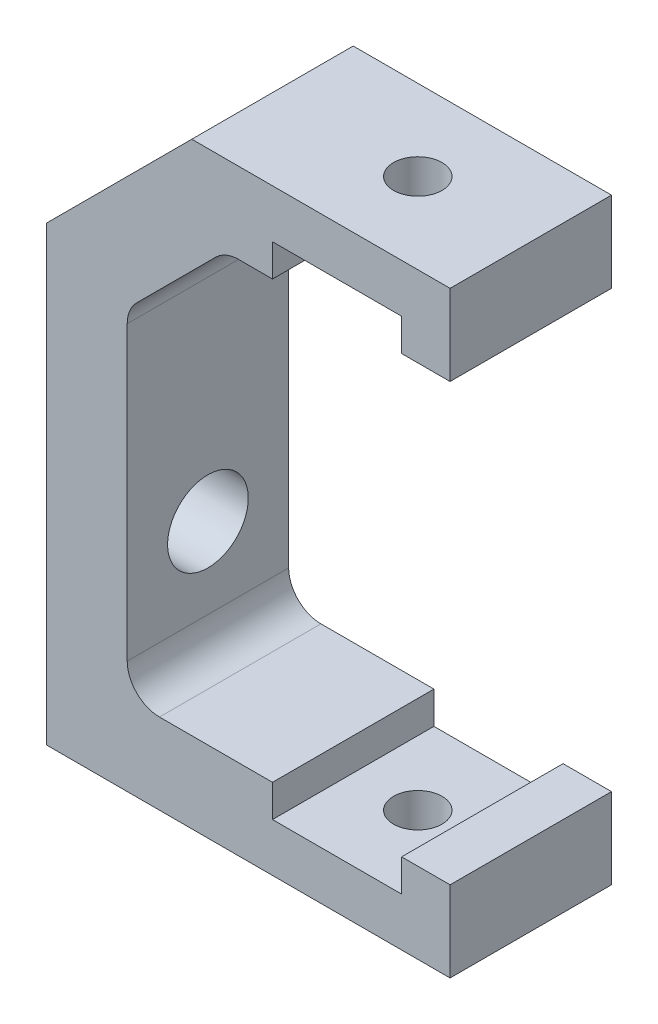
ISO-10303-21;
HEADER;
FILE_DESCRIPTION(('STEP AP214'),'2;1');
FILE_NAME('part.step','',(''),(''),'','','');
FILE_SCHEMA(('AUTOMOTIVE_DESIGN { 1 0 10303 214 1 1 1 1 }'));
ENDSEC;
DATA;
#1=APPLICATION_CONTEXT('core data for automotive mechanical design processes');
#2=APPLICATION_PROTOCOL_DEFINITION('international standard','automotive_design',2000,#1);
#3=PRODUCT_CONTEXT('',#1,'mechanical');
#4=PRODUCT('Part','Part','',(#3));
#5=PRODUCT_RELATED_PRODUCT_CATEGORY('part','',(#4));
#6=PRODUCT_DEFINITION_FORMATION('','',#4);
#7=PRODUCT_DEFINITION_CONTEXT('part definition',#1,'design');
#8=PRODUCT_DEFINITION('design','',#6,#7);
#9=PRODUCT_DEFINITION_SHAPE('','',#8);
#10=(LENGTH_UNIT() NAMED_UNIT(*) SI_UNIT(.MILLI.,.METRE.));
#11=(NAMED_UNIT(*) PLANE_ANGLE_UNIT() SI_UNIT($,.RADIAN.));
#12=(NAMED_UNIT(*) SI_UNIT($,.STERADIAN.) SOLID_ANGLE_UNIT());
#13=UNCERTAINTY_MEASURE_WITH_UNIT(LENGTH_MEASURE(1.E-05),#10,'distance_accuracy_value','');
#14=(GEOMETRIC_REPRESENTATION_CONTEXT(3) GLOBAL_UNCERTAINTY_ASSIGNED_CONTEXT((#13)) GLOBAL_UNIT_ASSIGNED_CONTEXT((#10,
#11,#12)) REPRESENTATION_CONTEXT('',''));
#15=CARTESIAN_POINT('',(0.,0.,0.));
#16=DIRECTION('',(0.,0.,1.));
#17=DIRECTION('',(1.,0.,0.));
#18=AXIS2_PLACEMENT_3D('',#15,#16,#17);
#19=CARTESIAN_POINT('',(0.,0.,10.));
#20=DIRECTION('',(1.,0.,0.));
#21=DIRECTION('',(0.,0.,-1.));
#22=AXIS2_PLACEMENT_3D('',#19,#20,#21);
#23=PLANE('',#22);
#24=CARTESIAN_POINT('',(0.,12.,5.));
#25=DIRECTION('',(-1.,0.,0.));
#26=DIRECTION('',(0.,0.,1.));
#27=AXIS2_PLACEMENT_3D('',#24,#25,#26);
#28=CIRCLE('',#27,2.5);
#29=CARTESIAN_POINT('',(0.,12.,7.5));
#30=VERTEX_POINT('',#29);
#31=EDGE_CURVE('E386',#30,#30,#28,.T.);
#32=ORIENTED_EDGE('',*,*,#31,.F.);
#33=EDGE_LOOP('',(#32));
#34=FACE_BOUND('',#33,.T.);
#35=DIRECTION('',(0.,-1.,0.));
#36=VECTOR('',#35,1.);
#37=CARTESIAN_POINT('',(0.,0.,0.));
#38=LINE('',#37,#36);
#39=CARTESIAN_POINT('',(0.,28.,0.));
#40=VERTEX_POINT('',#39);
#41=CARTESIAN_POINT('',(0.,0.,0.));
#42=VERTEX_POINT('',#41);
#43=EDGE_CURVE('E213',#40,#42,#38,.T.);
#44=ORIENTED_EDGE('',*,*,#43,.T.);
#45=DIRECTION('',(0.,0.,-1.));
#46=VECTOR('',#45,1.);
#47=CARTESIAN_POINT('',(0.,0.,10.));
#48=LINE('',#47,#46);
#49=CARTESIAN_POINT('',(0.,0.,10.));
#50=VERTEX_POINT('',#49);
#51=EDGE_CURVE('E11',#50,#42,#48,.T.);
#52=ORIENTED_EDGE('',*,*,#51,.F.);
#53=DIRECTION('',(0.,-1.,0.));
#54=VECTOR('',#53,1.);
#55=CARTESIAN_POINT('',(0.,0.,10.));
#56=LINE('',#55,#54);
#57=CARTESIAN_POINT('',(0.,28.,10.));
#58=VERTEX_POINT('',#57);
#59=EDGE_CURVE('E255',#58,#50,#56,.T.);
#60=ORIENTED_EDGE('',*,*,#59,.F.);
#61=DIRECTION('',(0.,0.,-1.));
#62=VECTOR('',#61,1.);
#63=CARTESIAN_POINT('',(0.,28.,10.));
#64=LINE('',#63,#62);
#65=EDGE_CURVE('E207',#58,#40,#64,.T.);
#66=ORIENTED_EDGE('',*,*,#65,.T.);
#67=EDGE_LOOP('',(#44,#52,#60,#66));
#68=FACE_BOUND('',#67,.T.);
#69=ADVANCED_FACE('F39',(#34,#68),#23,.F.);
#70=CARTESIAN_POINT('',(0.,0.,10.));
#71=DIRECTION('',(0.,1.,0.));
#72=DIRECTION('',(0.,0.,1.));
#73=AXIS2_PLACEMENT_3D('',#70,#71,#72);
#74=PLANE('',#73);
#75=CARTESIAN_POINT('',(18.,0.,5.));
#76=DIRECTION('',(0.,1.,0.));
#77=DIRECTION('',(0.,0.,1.));
#78=AXIS2_PLACEMENT_3D('',#75,#76,#77);
#79=CIRCLE('',#78,1.5);
#80=CARTESIAN_POINT('',(18.,0.,6.5));
#81=VERTEX_POINT('',#80);
#82=EDGE_CURVE('E220',#81,#81,#79,.T.);
#83=ORIENTED_EDGE('',*,*,#82,.T.);
#84=EDGE_LOOP('',(#83));
#85=FACE_BOUND('',#84,.T.);
#86=DIRECTION('',(1.,0.,0.));
#87=VECTOR('',#86,1.);
#88=CARTESIAN_POINT('',(0.,0.,0.));
#89=LINE('',#88,#87);
#90=CARTESIAN_POINT('',(25.,0.,0.));
#91=VERTEX_POINT('',#90);
#92=EDGE_CURVE('E216',#42,#91,#89,.T.);
#93=ORIENTED_EDGE('',*,*,#92,.T.);
#94=DIRECTION('',(0.,0.,-1.));
#95=VECTOR('',#94,1.);
#96=CARTESIAN_POINT('',(25.,0.,10.));
#97=LINE('',#96,#95);
#98=CARTESIAN_POINT('',(25.,0.,10.));
#99=VERTEX_POINT('',#98);
#100=EDGE_CURVE('E50',#99,#91,#97,.T.);
#101=ORIENTED_EDGE('',*,*,#100,.F.);
#102=DIRECTION('',(1.,0.,0.));
#103=VECTOR('',#102,1.);
#104=CARTESIAN_POINT('',(0.,0.,10.));
#105=LINE('',#104,#103);
#106=EDGE_CURVE('E139',#50,#99,#105,.T.);
#107=ORIENTED_EDGE('',*,*,#106,.F.);
#108=ORIENTED_EDGE('',*,*,#51,.T.);
#109=EDGE_LOOP('',(#93,#101,#107,#108));
#110=FACE_BOUND('',#109,.T.);
#111=ADVANCED_FACE('F377',(#85,#110),#74,.F.);
#112=CARTESIAN_POINT('',(25.,0.,10.));
#113=DIRECTION('',(-1.,0.,0.));
#114=DIRECTION('',(0.,0.,1.));
#115=AXIS2_PLACEMENT_3D('',#112,#113,#114);
#116=PLANE('',#115);
#117=DIRECTION('',(0.,1.,0.));
#118=VECTOR('',#117,1.);
#119=CARTESIAN_POINT('',(25.,0.,0.));
#120=LINE('',#119,#118);
#121=CARTESIAN_POINT('',(25.,5.,0.));
#122=VERTEX_POINT('',#121);
#123=EDGE_CURVE('E218',#91,#122,#120,.T.);
#124=ORIENTED_EDGE('',*,*,#123,.T.);
#125=DIRECTION('',(0.,0.,-1.));
#126=VECTOR('',#125,1.);
#127=CARTESIAN_POINT('',(25.,5.,10.));
#128=LINE('',#127,#126);
#129=CARTESIAN_POINT('',(25.,5.,10.));
#130=VERTEX_POINT('',#129);
#131=EDGE_CURVE('E298',#130,#122,#128,.T.);
#132=ORIENTED_EDGE('',*,*,#131,.F.);
#133=DIRECTION('',(0.,1.,0.));
#134=VECTOR('',#133,1.);
#135=CARTESIAN_POINT('',(25.,0.,10.));
#136=LINE('',#135,#134);
#137=EDGE_CURVE('E306',#99,#130,#136,.T.);
#138=ORIENTED_EDGE('',*,*,#137,.F.);
#139=ORIENTED_EDGE('',*,*,#100,.T.);
#140=EDGE_LOOP('',(#124,#132,#138,#139));
#141=FACE_BOUND('',#140,.T.);
#142=ADVANCED_FACE('F308',(#141),#116,.F.);
#143=CARTESIAN_POINT('',(25.,5.,10.));
#144=DIRECTION('',(0.,-1.,0.));
#145=DIRECTION('',(0.,0.,-1.));
#146=AXIS2_PLACEMENT_3D('',#143,#144,#145);
#147=PLANE('',#146);
#148=DIRECTION('',(-1.,0.,0.));
#149=VECTOR('',#148,1.);
#150=CARTESIAN_POINT('',(25.,5.,0.));
#151=LINE('',#150,#149);
#152=CARTESIAN_POINT('',(22.,5.,0.));
#153=VERTEX_POINT('',#152);
#154=EDGE_CURVE('E222',#122,#153,#151,.T.);
#155=ORIENTED_EDGE('',*,*,#154,.T.);
#156=DIRECTION('',(0.,0.,-1.));
#157=VECTOR('',#156,1.);
#158=CARTESIAN_POINT('',(22.,5.,10.));
#159=LINE('',#158,#157);
#160=CARTESIAN_POINT('',(22.,5.,10.));
#161=VERTEX_POINT('',#160);
#162=EDGE_CURVE('E300',#161,#153,#159,.T.);
#163=ORIENTED_EDGE('',*,*,#162,.F.);
#164=DIRECTION('',(-1.,0.,0.));
#165=VECTOR('',#164,1.);
#166=CARTESIAN_POINT('',(25.,5.,10.));
#167=LINE('',#166,#165);
#168=EDGE_CURVE('E326',#130,#161,#167,.T.);
#169=ORIENTED_EDGE('',*,*,#168,.F.);
#170=ORIENTED_EDGE('',*,*,#131,.T.);
#171=EDGE_LOOP('',(#155,#163,#169,#170));
#172=FACE_BOUND('',#171,.T.);
#173=ADVANCED_FACE('F320',(#172),#147,.F.);
#174=CARTESIAN_POINT('',(22.,5.,10.));
#175=DIRECTION('',(1.,0.,0.));
#176=DIRECTION('',(0.,0.,-1.));
#177=AXIS2_PLACEMENT_3D('',#174,#175,#176);
#178=PLANE('',#177);
#179=DIRECTION('',(0.,-1.,0.));
#180=VECTOR('',#179,1.);
#181=CARTESIAN_POINT('',(22.,5.,0.));
#182=LINE('',#181,#180);
#183=CARTESIAN_POINT('',(22.,3.,0.));
#184=VERTEX_POINT('',#183);
#185=EDGE_CURVE('E224',#153,#184,#182,.T.);
#186=ORIENTED_EDGE('',*,*,#185,.T.);
#187=DIRECTION('',(0.,0.,-1.));
#188=VECTOR('',#187,1.);
#189=CARTESIAN_POINT('',(22.,3.,10.));
#190=LINE('',#189,#188);
#191=CARTESIAN_POINT('',(22.,3.,10.));
#192=VERTEX_POINT('',#191);
#193=EDGE_CURVE('E294',#192,#184,#190,.T.);
#194=ORIENTED_EDGE('',*,*,#193,.F.);
#195=DIRECTION('',(0.,-1.,0.));
#196=VECTOR('',#195,1.);
#197=CARTESIAN_POINT('',(22.,5.,10.));
#198=LINE('',#197,#196);
#199=EDGE_CURVE('E323',#161,#192,#198,.T.);
#200=ORIENTED_EDGE('',*,*,#199,.F.);
#201=ORIENTED_EDGE('',*,*,#162,.T.);
#202=EDGE_LOOP('',(#186,#194,#200,#201));
#203=FACE_BOUND('',#202,.T.);
#204=ADVANCED_FACE('F321',(#203),#178,.F.);
#205=CARTESIAN_POINT('',(22.,3.,10.));
#206=DIRECTION('',(0.,-1.,0.));
#207=DIRECTION('',(1.,0.,0.));
#208=AXIS2_PLACEMENT_3D('',#205,#206,#207);
#209=PLANE('',#208);
#210=CARTESIAN_POINT('',(18.,3.,5.));
#211=DIRECTION('',(0.,-1.,0.));
#212=DIRECTION('',(1.,0.,0.));
#213=AXIS2_PLACEMENT_3D('',#210,#211,#212);
#214=CIRCLE('',#213,1.5);
#215=CARTESIAN_POINT('',(19.5,3.,5.));
#216=VERTEX_POINT('',#215);
#217=EDGE_CURVE('E405',#216,#216,#214,.T.);
#218=ORIENTED_EDGE('',*,*,#217,.T.);
#219=EDGE_LOOP('',(#218));
#220=FACE_BOUND('',#219,.T.);
#221=DIRECTION('',(-1.,0.,0.));
#222=VECTOR('',#221,1.);
#223=CARTESIAN_POINT('',(22.,3.,0.));
#224=LINE('',#223,#222);
#225=CARTESIAN_POINT('',(14.,3.,0.));
#226=VERTEX_POINT('',#225);
#227=EDGE_CURVE('E223',#184,#226,#224,.T.);
#228=ORIENTED_EDGE('',*,*,#227,.T.);
#229=DIRECTION('',(0.,0.,-1.));
#230=VECTOR('',#229,1.);
#231=CARTESIAN_POINT('',(14.,3.,10.));
#232=LINE('',#231,#230);
#233=CARTESIAN_POINT('',(14.,3.,10.));
#234=VERTEX_POINT('',#233);
#235=EDGE_CURVE('E292',#234,#226,#232,.T.);
#236=ORIENTED_EDGE('',*,*,#235,.F.);
#237=DIRECTION('',(-1.,0.,0.));
#238=VECTOR('',#237,1.);
#239=CARTESIAN_POINT('',(22.,3.,10.));
#240=LINE('',#239,#238);
#241=EDGE_CURVE('E324',#192,#234,#240,.T.);
#242=ORIENTED_EDGE('',*,*,#241,.F.);
#243=ORIENTED_EDGE('',*,*,#193,.T.);
#244=EDGE_LOOP('',(#228,#236,#242,#243));
#245=FACE_BOUND('',#244,.T.);
#246=ADVANCED_FACE('F437',(#220,#245),#209,.F.);
#247=CARTESIAN_POINT('',(14.,3.,10.));
#248=DIRECTION('',(-1.,0.,0.));
#249=DIRECTION('',(0.,0.,1.));
#250=AXIS2_PLACEMENT_3D('',#247,#248,#249);
#251=PLANE('',#250);
#252=DIRECTION('',(0.,1.,0.));
#253=VECTOR('',#252,1.);
#254=CARTESIAN_POINT('',(14.,3.,0.));
#255=LINE('',#254,#253);
#256=CARTESIAN_POINT('',(14.,5.,0.));
#257=VERTEX_POINT('',#256);
#258=EDGE_CURVE('E230',#226,#257,#255,.T.);
#259=ORIENTED_EDGE('',*,*,#258,.T.);
#260=DIRECTION('',(0.,0.,-1.));
#261=VECTOR('',#260,1.);
#262=CARTESIAN_POINT('',(14.,5.,10.));
#263=LINE('',#262,#261);
#264=CARTESIAN_POINT('',(14.,5.,10.));
#265=VERTEX_POINT('',#264);
#266=EDGE_CURVE('E290',#265,#257,#263,.T.);
#267=ORIENTED_EDGE('',*,*,#266,.F.);
#268=DIRECTION('',(0.,1.,0.));
#269=VECTOR('',#268,1.);
#270=CARTESIAN_POINT('',(14.,3.,10.));
#271=LINE('',#270,#269);
#272=EDGE_CURVE('E327',#234,#265,#271,.T.);
#273=ORIENTED_EDGE('',*,*,#272,.F.);
#274=ORIENTED_EDGE('',*,*,#235,.T.);
#275=EDGE_LOOP('',(#259,#267,#273,#274));
#276=FACE_BOUND('',#275,.T.);
#277=ADVANCED_FACE('F445',(#276),#251,.F.);
#278=CARTESIAN_POINT('',(14.,5.,10.));
#279=DIRECTION('',(0.,-1.,0.));
#280=DIRECTION('',(1.,0.,0.));
#281=AXIS2_PLACEMENT_3D('',#278,#279,#280);
#282=PLANE('',#281);
#283=DIRECTION('',(-1.,0.,0.));
#284=VECTOR('',#283,1.);
#285=CARTESIAN_POINT('',(14.,5.,0.));
#286=LINE('',#285,#284);
#287=CARTESIAN_POINT('',(7.,5.,0.));
#288=VERTEX_POINT('',#287);
#289=EDGE_CURVE('E226',#257,#288,#286,.T.);
#290=ORIENTED_EDGE('',*,*,#289,.T.);
#291=DIRECTION('',(0.,0.,-1.));
#292=VECTOR('',#291,1.);
#293=CARTESIAN_POINT('',(7.,5.,10.));
#294=LINE('',#293,#292);
#295=CARTESIAN_POINT('',(7.,5.,10.));
#296=VERTEX_POINT('',#295);
#297=EDGE_CURVE('E283',#296,#288,#294,.T.);
#298=ORIENTED_EDGE('',*,*,#297,.F.);
#299=DIRECTION('',(-1.,0.,0.));
#300=VECTOR('',#299,1.);
#301=CARTESIAN_POINT('',(14.,5.,10.));
#302=LINE('',#301,#300);
#303=EDGE_CURVE('E331',#265,#296,#302,.T.);
#304=ORIENTED_EDGE('',*,*,#303,.F.);
#305=ORIENTED_EDGE('',*,*,#266,.T.);
#306=EDGE_LOOP('',(#290,#298,#304,#305));
#307=FACE_BOUND('',#306,.T.);
#308=ADVANCED_FACE('F578',(#307),#282,.F.);
#309=CARTESIAN_POINT('',(7.,7.,10.));
#310=DIRECTION('',(0.,0.,-1.));
#311=DIRECTION('',(-1.,0.,0.));
#312=AXIS2_PLACEMENT_3D('',#309,#310,#311);
#313=CYLINDRICAL_SURFACE('',#312,2.);
#314=CARTESIAN_POINT('',(7.,7.,0.));
#315=DIRECTION('',(0.,0.,-1.));
#316=DIRECTION('',(-1.,0.,0.));
#317=AXIS2_PLACEMENT_3D('',#314,#315,#316);
#318=CIRCLE('',#317,2.);
#319=CARTESIAN_POINT('',(5.,7.,0.));
#320=VERTEX_POINT('',#319);
#321=EDGE_CURVE('E232',#288,#320,#318,.T.);
#322=ORIENTED_EDGE('',*,*,#321,.T.);
#323=DIRECTION('',(0.,0.,-1.));
#324=VECTOR('',#323,1.);
#325=CARTESIAN_POINT('',(5.,7.,10.));
#326=LINE('',#325,#324);
#327=CARTESIAN_POINT('',(5.,7.,10.));
#328=VERTEX_POINT('',#327);
#329=EDGE_CURVE('E285',#328,#320,#326,.T.);
#330=ORIENTED_EDGE('',*,*,#329,.F.);
#331=CARTESIAN_POINT('',(7.,7.,10.));
#332=DIRECTION('',(0.,0.,-1.));
#333=DIRECTION('',(-1.,0.,0.));
#334=AXIS2_PLACEMENT_3D('',#331,#332,#333);
#335=CIRCLE('',#334,2.);
#336=EDGE_CURVE('E337',#296,#328,#335,.T.);
#337=ORIENTED_EDGE('',*,*,#336,.F.);
#338=ORIENTED_EDGE('',*,*,#297,.T.);
#339=EDGE_LOOP('',(#322,#330,#337,#338));
#340=FACE_BOUND('',#339,.T.);
#341=ADVANCED_FACE('F486',(#340),#313,.F.);
#342=CARTESIAN_POINT('',(5.,25.1005050633883,10.));
#343=DIRECTION('',(-1.,0.,0.));
#344=DIRECTION('',(0.,-1.,0.));
#345=AXIS2_PLACEMENT_3D('',#342,#343,#344);
#346=PLANE('',#345);
#347=CARTESIAN_POINT('',(5.,12.,5.));
#348=DIRECTION('',(-1.,0.,0.));
#349=DIRECTION('',(0.,-1.,0.));
#350=AXIS2_PLACEMENT_3D('',#347,#348,#349);
#351=CIRCLE('',#350,2.5);
#352=CARTESIAN_POINT('',(5.,9.5,5.));
#353=VERTEX_POINT('',#352);
#354=EDGE_CURVE('E392',#353,#353,#351,.F.);
#355=ORIENTED_EDGE('',*,*,#354,.F.);
#356=EDGE_LOOP('',(#355));
#357=FACE_BOUND('',#356,.T.);
#358=DIRECTION('',(0.,1.,0.));
#359=VECTOR('',#358,1.);
#360=CARTESIAN_POINT('',(5.,25.1005050633883,0.));
#361=LINE('',#360,#359);
#362=CARTESIAN_POINT('',(5.,25.1005050633883,0.));
#363=VERTEX_POINT('',#362);
#364=EDGE_CURVE('E235',#320,#363,#361,.T.);
#365=ORIENTED_EDGE('',*,*,#364,.T.);
#366=DIRECTION('',(0.,0.,-1.));
#367=VECTOR('',#366,1.);
#368=CARTESIAN_POINT('',(5.,25.1005050633883,10.));
#369=LINE('',#368,#367);
#370=CARTESIAN_POINT('',(5.,25.1005050633883,10.));
#371=VERTEX_POINT('',#370);
#372=EDGE_CURVE('E276',#371,#363,#369,.T.);
#373=ORIENTED_EDGE('',*,*,#372,.F.);
#374=DIRECTION('',(0.,1.,0.));
#375=VECTOR('',#374,1.);
#376=CARTESIAN_POINT('',(5.,25.1005050633883,10.));
#377=LINE('',#376,#375);
#378=EDGE_CURVE('E339',#328,#371,#377,.T.);
#379=ORIENTED_EDGE('',*,*,#378,.F.);
#380=ORIENTED_EDGE('',*,*,#329,.T.);
#381=EDGE_LOOP('',(#365,#373,#379,#380));
#382=FACE_BOUND('',#381,.T.);
#383=ADVANCED_FACE('F485',(#357,#382),#346,.F.);
#384=CARTESIAN_POINT('',(7.,25.1005050633883,10.));
#385=DIRECTION('',(0.,0.,-1.));
#386=DIRECTION('',(-1.,0.,0.));
#387=AXIS2_PLACEMENT_3D('',#384,#385,#386);
#388=CYLINDRICAL_SURFACE('',#387,2.);
#389=CARTESIAN_POINT('',(7.,25.1005050633883,0.));
#390=DIRECTION('',(0.,0.,-1.));
#391=DIRECTION('',(1.,0.,0.));
#392=AXIS2_PLACEMENT_3D('',#389,#390,#391);
#393=CIRCLE('',#392,2.);
#394=CARTESIAN_POINT('',(5.5857864376269,26.5147186257614,0.));
#395=VERTEX_POINT('',#394);
#396=EDGE_CURVE('E233',#363,#395,#393,.T.);
#397=ORIENTED_EDGE('',*,*,#396,.T.);
#398=DIRECTION('',(0.,0.,-1.));
#399=VECTOR('',#398,1.);
#400=CARTESIAN_POINT('',(5.5857864376269,26.5147186257614,10.));
#401=LINE('',#400,#399);
#402=CARTESIAN_POINT('',(5.5857864376269,26.5147186257614,10.));
#403=VERTEX_POINT('',#402);
#404=EDGE_CURVE('E277',#403,#395,#401,.T.);
#405=ORIENTED_EDGE('',*,*,#404,.F.);
#406=CARTESIAN_POINT('',(7.,25.1005050633883,10.));
#407=DIRECTION('',(0.,0.,-1.));
#408=DIRECTION('',(1.,0.,0.));
#409=AXIS2_PLACEMENT_3D('',#406,#407,#408);
#410=CIRCLE('',#409,2.);
#411=EDGE_CURVE('E338',#371,#403,#410,.T.);
#412=ORIENTED_EDGE('',*,*,#411,.F.);
#413=ORIENTED_EDGE('',*,*,#372,.T.);
#414=EDGE_LOOP('',(#397,#405,#412,#413));
#415=FACE_BOUND('',#414,.T.);
#416=ADVANCED_FACE('F484',(#415),#388,.F.);
#417=CARTESIAN_POINT('',(10.4852813742385,31.4142135623731,10.));
#418=DIRECTION('',(-0.707106781186549,0.707106781186546,0.));
#419=DIRECTION('',(-0.707106781186546,-0.707106781186549,0.));
#420=AXIS2_PLACEMENT_3D('',#417,#418,#419);
#421=PLANE('',#420);
#422=DIRECTION('',(0.707106781186545,0.707106781186549,0.));
#423=VECTOR('',#422,1.);
#424=CARTESIAN_POINT('',(10.4852813742385,31.4142135623731,0.));
#425=LINE('',#424,#423);
#426=CARTESIAN_POINT('',(10.4852813742385,31.4142135623731,0.));
#427=VERTEX_POINT('',#426);
#428=EDGE_CURVE('E240',#395,#427,#425,.T.);
#429=ORIENTED_EDGE('',*,*,#428,.T.);
#430=DIRECTION('',(0.,0.,-1.));
#431=VECTOR('',#430,1.);
#432=CARTESIAN_POINT('',(10.4852813742385,31.4142135623731,10.));
#433=LINE('',#432,#431);
#434=CARTESIAN_POINT('',(10.4852813742385,31.4142135623731,10.));
#435=VERTEX_POINT('',#434);
#436=EDGE_CURVE('E272',#435,#427,#433,.T.);
#437=ORIENTED_EDGE('',*,*,#436,.F.);
#438=DIRECTION('',(0.707106781186545,0.707106781186549,0.));
#439=VECTOR('',#438,1.);
#440=CARTESIAN_POINT('',(10.4852813742385,31.4142135623731,10.));
#441=LINE('',#440,#439);
#442=EDGE_CURVE('E344',#403,#435,#441,.T.);
#443=ORIENTED_EDGE('',*,*,#442,.F.);
#444=ORIENTED_EDGE('',*,*,#404,.T.);
#445=EDGE_LOOP('',(#429,#437,#443,#444));
#446=FACE_BOUND('',#445,.T.);
#447=ADVANCED_FACE('F503',(#446),#421,.F.);
#448=CARTESIAN_POINT('',(11.8994949366116,30.,10.));
#449=DIRECTION('',(0.,0.,-1.));
#450=DIRECTION('',(-1.,0.,0.));
#451=AXIS2_PLACEMENT_3D('',#448,#449,#450);
#452=CYLINDRICAL_SURFACE('',#451,2.);
#453=CARTESIAN_POINT('',(11.8994949366116,30.,0.));
#454=DIRECTION('',(0.,0.,-1.));
#455=DIRECTION('',(-1.,0.,0.));
#456=AXIS2_PLACEMENT_3D('',#453,#454,#455);
#457=CIRCLE('',#456,2.);
#458=CARTESIAN_POINT('',(11.8994949366116,32.,0.));
#459=VERTEX_POINT('',#458);
#460=EDGE_CURVE('E239',#427,#459,#457,.T.);
#461=ORIENTED_EDGE('',*,*,#460,.T.);
#462=DIRECTION('',(0.,0.,-1.));
#463=VECTOR('',#462,1.);
#464=CARTESIAN_POINT('',(11.8994949366116,32.,10.));
#465=LINE('',#464,#463);
#466=CARTESIAN_POINT('',(11.8994949366116,32.,10.));
#467=VERTEX_POINT('',#466);
#468=EDGE_CURVE('E269',#467,#459,#465,.T.);
#469=ORIENTED_EDGE('',*,*,#468,.F.);
#470=CARTESIAN_POINT('',(11.8994949366116,30.,10.));
#471=DIRECTION('',(0.,0.,-1.));
#472=DIRECTION('',(-1.,0.,0.));
#473=AXIS2_PLACEMENT_3D('',#470,#471,#472);
#474=CIRCLE('',#473,2.);
#475=EDGE_CURVE('E341',#435,#467,#474,.T.);
#476=ORIENTED_EDGE('',*,*,#475,.F.);
#477=ORIENTED_EDGE('',*,*,#436,.T.);
#478=EDGE_LOOP('',(#461,#469,#476,#477));
#479=FACE_BOUND('',#478,.T.);
#480=ADVANCED_FACE('F513',(#479),#452,.F.);
#481=CARTESIAN_POINT('',(14.,32.,10.));
#482=DIRECTION('',(0.,1.,0.));
#483=DIRECTION('',(0.,0.,1.));
#484=AXIS2_PLACEMENT_3D('',#481,#482,#483);
#485=PLANE('',#484);
#486=DIRECTION('',(1.,0.,0.));
#487=VECTOR('',#486,1.);
#488=CARTESIAN_POINT('',(14.,32.,0.));
#489=LINE('',#488,#487);
#490=CARTESIAN_POINT('',(14.,32.,0.));
#491=VERTEX_POINT('',#490);
#492=EDGE_CURVE('E242',#459,#491,#489,.T.);
#493=ORIENTED_EDGE('',*,*,#492,.T.);
#494=DIRECTION('',(0.,0.,-1.));
#495=VECTOR('',#494,1.);
#496=CARTESIAN_POINT('',(14.,32.,10.));
#497=LINE('',#496,#495);
#498=CARTESIAN_POINT('',(14.,32.,10.));
#499=VERTEX_POINT('',#498);
#500=EDGE_CURVE('E270',#499,#491,#497,.T.);
#501=ORIENTED_EDGE('',*,*,#500,.F.);
#502=DIRECTION('',(1.,0.,0.));
#503=VECTOR('',#502,1.);
#504=CARTESIAN_POINT('',(14.,32.,10.));
#505=LINE('',#504,#503);
#506=EDGE_CURVE('E347',#467,#499,#505,.T.);
#507=ORIENTED_EDGE('',*,*,#506,.F.);
#508=ORIENTED_EDGE('',*,*,#468,.T.);
#509=EDGE_LOOP('',(#493,#501,#507,#508));
#510=FACE_BOUND('',#509,.T.);
#511=ADVANCED_FACE('F523',(#510),#485,.F.);
#512=CARTESIAN_POINT('',(14.,34.,10.));
#513=DIRECTION('',(-1.,0.,0.));
#514=DIRECTION('',(0.,0.,1.));
#515=AXIS2_PLACEMENT_3D('',#512,#513,#514);
#516=PLANE('',#515);
#517=DIRECTION('',(0.,1.,0.));
#518=VECTOR('',#517,1.);
#519=CARTESIAN_POINT('',(14.,34.,0.));
#520=LINE('',#519,#518);
#521=CARTESIAN_POINT('',(14.,34.,0.));
#522=VERTEX_POINT('',#521);
#523=EDGE_CURVE('E244',#491,#522,#520,.T.);
#524=ORIENTED_EDGE('',*,*,#523,.T.);
#525=DIRECTION('',(0.,0.,-1.));
#526=VECTOR('',#525,1.);
#527=CARTESIAN_POINT('',(14.,34.,10.));
#528=LINE('',#527,#526);
#529=CARTESIAN_POINT('',(14.,34.,10.));
#530=VERTEX_POINT('',#529);
#531=EDGE_CURVE('E262',#530,#522,#528,.T.);
#532=ORIENTED_EDGE('',*,*,#531,.F.);
#533=DIRECTION('',(0.,1.,0.));
#534=VECTOR('',#533,1.);
#535=CARTESIAN_POINT('',(14.,34.,10.));
#536=LINE('',#535,#534);
#537=EDGE_CURVE('E346',#499,#530,#536,.T.);
#538=ORIENTED_EDGE('',*,*,#537,.F.);
#539=ORIENTED_EDGE('',*,*,#500,.T.);
#540=EDGE_LOOP('',(#524,#532,#538,#539));
#541=FACE_BOUND('',#540,.T.);
#542=ADVANCED_FACE('F455',(#541),#516,.F.);
#543=CARTESIAN_POINT('',(22.,34.,10.));
#544=DIRECTION('',(0.,1.,0.));
#545=DIRECTION('',(0.,0.,1.));
#546=AXIS2_PLACEMENT_3D('',#543,#544,#545);
#547=PLANE('',#546);
#548=CARTESIAN_POINT('',(18.,34.,5.));
#549=DIRECTION('',(0.,1.,0.));
#550=DIRECTION('',(0.,0.,1.));
#551=AXIS2_PLACEMENT_3D('',#548,#549,#550);
#552=CIRCLE('',#551,1.5);
#553=CARTESIAN_POINT('',(18.,34.,6.5));
#554=VERTEX_POINT('',#553);
#555=EDGE_CURVE('E396',#554,#554,#552,.T.);
#556=ORIENTED_EDGE('',*,*,#555,.T.);
#557=EDGE_LOOP('',(#556));
#558=FACE_BOUND('',#557,.T.);
#559=DIRECTION('',(1.,0.,0.));
#560=VECTOR('',#559,1.);
#561=CARTESIAN_POINT('',(22.,34.,0.));
#562=LINE('',#561,#560);
#563=CARTESIAN_POINT('',(22.,34.,0.));
#564=VERTEX_POINT('',#563);
#565=EDGE_CURVE('E243',#522,#564,#562,.T.);
#566=ORIENTED_EDGE('',*,*,#565,.T.);
#567=DIRECTION('',(0.,0.,-1.));
#568=VECTOR('',#567,1.);
#569=CARTESIAN_POINT('',(22.,34.,10.));
#570=LINE('',#569,#568);
#571=CARTESIAN_POINT('',(22.,34.,10.));
#572=VERTEX_POINT('',#571);
#573=EDGE_CURVE('E261',#572,#564,#570,.T.);
#574=ORIENTED_EDGE('',*,*,#573,.F.);
#575=DIRECTION('',(1.,0.,0.));
#576=VECTOR('',#575,1.);
#577=CARTESIAN_POINT('',(22.,34.,10.));
#578=LINE('',#577,#576);
#579=EDGE_CURVE('E348',#530,#572,#578,.T.);
#580=ORIENTED_EDGE('',*,*,#579,.F.);
#581=ORIENTED_EDGE('',*,*,#531,.T.);
#582=EDGE_LOOP('',(#566,#574,#580,#581));
#583=FACE_BOUND('',#582,.T.);
#584=ADVANCED_FACE('F448',(#558,#583),#547,.F.);
#585=CARTESIAN_POINT('',(22.,32.,10.));
#586=DIRECTION('',(1.,0.,0.));
#587=DIRECTION('',(0.,0.,-1.));
#588=AXIS2_PLACEMENT_3D('',#585,#586,#587);
#589=PLANE('',#588);
#590=DIRECTION('',(0.,-1.,0.));
#591=VECTOR('',#590,1.);
#592=CARTESIAN_POINT('',(22.,32.,0.));
#593=LINE('',#592,#591);
#594=CARTESIAN_POINT('',(22.,32.,0.));
#595=VERTEX_POINT('',#594);
#596=EDGE_CURVE('E249',#564,#595,#593,.T.);
#597=ORIENTED_EDGE('',*,*,#596,.T.);
#598=DIRECTION('',(0.,0.,-1.));
#599=VECTOR('',#598,1.);
#600=CARTESIAN_POINT('',(22.,32.,10.));
#601=LINE('',#600,#599);
#602=CARTESIAN_POINT('',(22.,32.,10.));
#603=VERTEX_POINT('',#602);
#604=EDGE_CURVE('E256',#603,#595,#601,.T.);
#605=ORIENTED_EDGE('',*,*,#604,.F.);
#606=DIRECTION('',(0.,-1.,0.));
#607=VECTOR('',#606,1.);
#608=CARTESIAN_POINT('',(22.,32.,10.));
#609=LINE('',#608,#607);
#610=EDGE_CURVE('E355',#572,#603,#609,.T.);
#611=ORIENTED_EDGE('',*,*,#610,.F.);
#612=ORIENTED_EDGE('',*,*,#573,.T.);
#613=EDGE_LOOP('',(#597,#605,#611,#612));
#614=FACE_BOUND('',#613,.T.);
#615=ADVANCED_FACE('F360',(#614),#589,.F.);
#616=CARTESIAN_POINT('',(25.,32.,10.));
#617=DIRECTION('',(0.,1.,0.));
#618=DIRECTION('',(0.,0.,1.));
#619=AXIS2_PLACEMENT_3D('',#616,#617,#618);
#620=PLANE('',#619);
#621=DIRECTION('',(1.,0.,0.));
#622=VECTOR('',#621,1.);
#623=CARTESIAN_POINT('',(25.,32.,0.));
#624=LINE('',#623,#622);
#625=CARTESIAN_POINT('',(25.,32.,0.));
#626=VERTEX_POINT('',#625);
#627=EDGE_CURVE('E246',#595,#626,#624,.T.);
#628=ORIENTED_EDGE('',*,*,#627,.T.);
#629=DIRECTION('',(0.,0.,-1.));
#630=VECTOR('',#629,1.);
#631=CARTESIAN_POINT('',(25.,32.,10.));
#632=LINE('',#631,#630);
#633=CARTESIAN_POINT('',(25.,32.,10.));
#634=VERTEX_POINT('',#633);
#635=EDGE_CURVE('E204',#634,#626,#632,.T.);
#636=ORIENTED_EDGE('',*,*,#635,.F.);
#637=DIRECTION('',(1.,0.,0.));
#638=VECTOR('',#637,1.);
#639=CARTESIAN_POINT('',(25.,32.,10.));
#640=LINE('',#639,#638);
#641=EDGE_CURVE('E193',#603,#634,#640,.T.);
#642=ORIENTED_EDGE('',*,*,#641,.F.);
#643=ORIENTED_EDGE('',*,*,#604,.T.);
#644=EDGE_LOOP('',(#628,#636,#642,#643));
#645=FACE_BOUND('',#644,.T.);
#646=ADVANCED_FACE('F362',(#645),#620,.F.);
#647=CARTESIAN_POINT('',(25.,37.,10.));
#648=DIRECTION('',(-1.,0.,0.));
#649=DIRECTION('',(0.,0.,1.));
#650=AXIS2_PLACEMENT_3D('',#647,#648,#649);
#651=PLANE('',#650);
#652=DIRECTION('',(0.,1.,0.));
#653=VECTOR('',#652,1.);
#654=CARTESIAN_POINT('',(25.,37.,0.));
#655=LINE('',#654,#653);
#656=CARTESIAN_POINT('',(25.,37.,0.));
#657=VERTEX_POINT('',#656);
#658=EDGE_CURVE('E201',#626,#657,#655,.T.);
#659=ORIENTED_EDGE('',*,*,#658,.T.);
#660=DIRECTION('',(0.,0.,-1.));
#661=VECTOR('',#660,1.);
#662=CARTESIAN_POINT('',(25.,37.,10.));
#663=LINE('',#662,#661);
#664=CARTESIAN_POINT('',(25.,37.,10.));
#665=VERTEX_POINT('',#664);
#666=EDGE_CURVE('E199',#665,#657,#663,.T.);
#667=ORIENTED_EDGE('',*,*,#666,.F.);
#668=DIRECTION('',(0.,1.,0.));
#669=VECTOR('',#668,1.);
#670=CARTESIAN_POINT('',(25.,37.,10.));
#671=LINE('',#670,#669);
#672=EDGE_CURVE('E186',#634,#665,#671,.T.);
#673=ORIENTED_EDGE('',*,*,#672,.F.);
#674=ORIENTED_EDGE('',*,*,#635,.T.);
#675=EDGE_LOOP('',(#659,#667,#673,#674));
#676=FACE_BOUND('',#675,.T.);
#677=ADVANCED_FACE('F203',(#676),#651,.F.);
#678=CARTESIAN_POINT('',(8.99999999999997,37.,10.));
#679=DIRECTION('',(0.,-1.,0.));
#680=DIRECTION('',(0.,0.,-1.));
#681=AXIS2_PLACEMENT_3D('',#678,#679,#680);
#682=PLANE('',#681);
#683=CARTESIAN_POINT('',(18.,37.,5.));
#684=DIRECTION('',(0.,1.,0.));
#685=DIRECTION('',(0.,0.,1.));
#686=AXIS2_PLACEMENT_3D('',#683,#684,#685);
#687=CIRCLE('',#686,1.5);
#688=CARTESIAN_POINT('',(18.,37.,6.5));
#689=VERTEX_POINT('',#688);
#690=EDGE_CURVE('E391',#689,#689,#687,.T.);
#691=ORIENTED_EDGE('',*,*,#690,.F.);
#692=EDGE_LOOP('',(#691));
#693=FACE_BOUND('',#692,.T.);
#694=DIRECTION('',(-1.,0.,0.));
#695=VECTOR('',#694,1.);
#696=CARTESIAN_POINT('',(8.99999999999997,37.,0.));
#697=LINE('',#696,#695);
#698=CARTESIAN_POINT('',(8.99999999999997,37.,0.));
#699=VERTEX_POINT('',#698);
#700=EDGE_CURVE('E125',#657,#699,#697,.T.);
#701=ORIENTED_EDGE('',*,*,#700,.T.);
#702=DIRECTION('',(0.,0.,-1.));
#703=VECTOR('',#702,1.);
#704=CARTESIAN_POINT('',(8.99999999999997,37.,10.));
#705=LINE('',#704,#703);
#706=CARTESIAN_POINT('',(8.99999999999997,37.,10.));
#707=VERTEX_POINT('',#706);
#708=EDGE_CURVE('E202',#707,#699,#705,.T.);
#709=ORIENTED_EDGE('',*,*,#708,.F.);
#710=DIRECTION('',(-1.,0.,0.));
#711=VECTOR('',#710,1.);
#712=CARTESIAN_POINT('',(8.99999999999997,37.,10.));
#713=LINE('',#712,#711);
#714=EDGE_CURVE('E195',#665,#707,#713,.T.);
#715=ORIENTED_EDGE('',*,*,#714,.F.);
#716=ORIENTED_EDGE('',*,*,#666,.T.);
#717=EDGE_LOOP('',(#701,#709,#715,#716));
#718=FACE_BOUND('',#717,.T.);
#719=ADVANCED_FACE('F210',(#693,#718),#682,.F.);
#720=CARTESIAN_POINT('',(0.,28.,10.));
#721=DIRECTION('',(0.707106781186549,-0.707106781186546,0.));
#722=DIRECTION('',(0.707106781186546,0.707106781186549,0.));
#723=AXIS2_PLACEMENT_3D('',#720,#721,#722);
#724=PLANE('',#723);
#725=DIRECTION('',(-0.707106781186546,-0.707106781186549,0.));
#726=VECTOR('',#725,1.);
#727=CARTESIAN_POINT('',(0.,28.,0.));
#728=LINE('',#727,#726);
#729=EDGE_CURVE('E129',#699,#40,#728,.T.);
#730=ORIENTED_EDGE('',*,*,#729,.T.);
#731=ORIENTED_EDGE('',*,*,#65,.F.);
#732=DIRECTION('',(-0.707106781186546,-0.707106781186549,0.));
#733=VECTOR('',#732,1.);
#734=CARTESIAN_POINT('',(0.,28.,10.));
#735=LINE('',#734,#733);
#736=EDGE_CURVE('E54',#707,#58,#735,.T.);
#737=ORIENTED_EDGE('',*,*,#736,.F.);
#738=ORIENTED_EDGE('',*,*,#708,.T.);
#739=EDGE_LOOP('',(#730,#731,#737,#738));
#740=FACE_BOUND('',#739,.T.);
#741=ADVANCED_FACE('F368',(#740),#724,.F.);
#742=CARTESIAN_POINT('',(11.8994949366116,30.,10.));
#743=DIRECTION('',(0.,0.,-1.));
#744=DIRECTION('',(-1.,0.,0.));
#745=AXIS2_PLACEMENT_3D('',#742,#743,#744);
#746=PLANE('',#745);
#747=ORIENTED_EDGE('',*,*,#59,.T.);
#748=ORIENTED_EDGE('',*,*,#106,.T.);
#749=ORIENTED_EDGE('',*,*,#137,.T.);
#750=ORIENTED_EDGE('',*,*,#168,.T.);
#751=ORIENTED_EDGE('',*,*,#199,.T.);
#752=ORIENTED_EDGE('',*,*,#241,.T.);
#753=ORIENTED_EDGE('',*,*,#272,.T.);
#754=ORIENTED_EDGE('',*,*,#303,.T.);
#755=ORIENTED_EDGE('',*,*,#336,.T.);
#756=ORIENTED_EDGE('',*,*,#378,.T.);
#757=ORIENTED_EDGE('',*,*,#411,.T.);
#758=ORIENTED_EDGE('',*,*,#442,.T.);
#759=ORIENTED_EDGE('',*,*,#475,.T.);
#760=ORIENTED_EDGE('',*,*,#506,.T.);
#761=ORIENTED_EDGE('',*,*,#537,.T.);
#762=ORIENTED_EDGE('',*,*,#579,.T.);
#763=ORIENTED_EDGE('',*,*,#610,.T.);
#764=ORIENTED_EDGE('',*,*,#641,.T.);
#765=ORIENTED_EDGE('',*,*,#672,.T.);
#766=ORIENTED_EDGE('',*,*,#714,.T.);
#767=ORIENTED_EDGE('',*,*,#736,.T.);
#768=EDGE_LOOP('',(#747,#748,#749,#750,#751,#752,#753,#754,#755,#756,#757,#758,#759,#760,#761,
#762,#763,#764,#765,#766,#767));
#769=FACE_BOUND('',#768,.T.);
#770=ADVANCED_FACE('F192',(#769),#746,.F.);
#771=CARTESIAN_POINT('',(11.8994949366116,30.,0.));
#772=DIRECTION('',(0.,0.,-1.));
#773=DIRECTION('',(-1.,0.,0.));
#774=AXIS2_PLACEMENT_3D('',#771,#772,#773);
#775=PLANE('',#774);
#776=ORIENTED_EDGE('',*,*,#43,.F.);
#777=ORIENTED_EDGE('',*,*,#729,.F.);
#778=ORIENTED_EDGE('',*,*,#700,.F.);
#779=ORIENTED_EDGE('',*,*,#658,.F.);
#780=ORIENTED_EDGE('',*,*,#627,.F.);
#781=ORIENTED_EDGE('',*,*,#596,.F.);
#782=ORIENTED_EDGE('',*,*,#565,.F.);
#783=ORIENTED_EDGE('',*,*,#523,.F.);
#784=ORIENTED_EDGE('',*,*,#492,.F.);
#785=ORIENTED_EDGE('',*,*,#460,.F.);
#786=ORIENTED_EDGE('',*,*,#428,.F.);
#787=ORIENTED_EDGE('',*,*,#396,.F.);
#788=ORIENTED_EDGE('',*,*,#364,.F.);
#789=ORIENTED_EDGE('',*,*,#321,.F.);
#790=ORIENTED_EDGE('',*,*,#289,.F.);
#791=ORIENTED_EDGE('',*,*,#258,.F.);
#792=ORIENTED_EDGE('',*,*,#227,.F.);
#793=ORIENTED_EDGE('',*,*,#185,.F.);
#794=ORIENTED_EDGE('',*,*,#154,.F.);
#795=ORIENTED_EDGE('',*,*,#123,.F.);
#796=ORIENTED_EDGE('',*,*,#92,.F.);
#797=EDGE_LOOP('',(#776,#777,#778,#779,#780,#781,#782,#783,#784,#785,#786,#787,#788,#789,#790,
#791,#792,#793,#794,#795,#796));
#798=FACE_BOUND('',#797,.T.);
#799=ADVANCED_FACE('F315',(#798),#775,.T.);
#800=CARTESIAN_POINT('',(18.,-1.,5.));
#801=DIRECTION('',(0.,1.,0.));
#802=DIRECTION('',(0.,0.,1.));
#803=AXIS2_PLACEMENT_3D('',#800,#801,#802);
#804=CYLINDRICAL_SURFACE('',#803,1.5);
#805=ORIENTED_EDGE('',*,*,#690,.T.);
#806=EDGE_LOOP('',(#805));
#807=FACE_BOUND('',#806,.T.);
#808=ORIENTED_EDGE('',*,*,#555,.F.);
#809=EDGE_LOOP('',(#808));
#810=FACE_BOUND('',#809,.T.);
#811=ADVANCED_FACE('F414',(#807,#810),#804,.F.);
#812=ORIENTED_EDGE('',*,*,#217,.F.);
#813=EDGE_LOOP('',(#812));
#814=FACE_BOUND('',#813,.T.);
#815=ORIENTED_EDGE('',*,*,#82,.F.);
#816=EDGE_LOOP('',(#815));
#817=FACE_BOUND('',#816,.T.);
#818=ADVANCED_FACE('F408',(#814,#817),#804,.F.);
#819=CARTESIAN_POINT('',(25.001,12.,5.));
#820=DIRECTION('',(-1.,0.,0.));
#821=DIRECTION('',(0.,0.,1.));
#822=AXIS2_PLACEMENT_3D('',#819,#820,#821);
#823=CYLINDRICAL_SURFACE('',#822,2.5);
#824=ORIENTED_EDGE('',*,*,#31,.T.);
#825=EDGE_LOOP('',(#824));
#826=FACE_BOUND('',#825,.T.);
#827=ORIENTED_EDGE('',*,*,#354,.T.);
#828=EDGE_LOOP('',(#827));
#829=FACE_BOUND('',#828,.T.);
#830=ADVANCED_FACE('F412',(#826,#829),#823,.F.);
#831=CLOSED_SHELL('',(#69,#111,#142,#173,#204,#246,#277,#308,#341,#383,#416,#447,#480,#511,#542,
#584,#615,#646,#677,#719,#741,#770,#799,#811,#818,#830));
#832=MANIFOLD_SOLID_BREP('B2',#831);
#833=ADVANCED_BREP_SHAPE_REPRESENTATION('',(#18,#832),#14);
#834=SHAPE_DEFINITION_REPRESENTATION(#9,#833);
ENDSEC;
END-ISO-10303-21;
